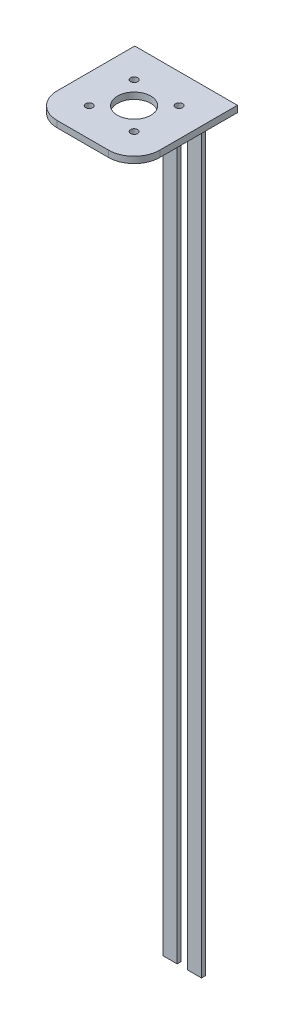
ISO-10303-21;
HEADER;
FILE_DESCRIPTION(('STEP AP214'),'2;1');
FILE_NAME('part.step','',(''),(''),'','','');
FILE_SCHEMA(('AUTOMOTIVE_DESIGN { 1 0 10303 214 1 1 1 1 }'));
ENDSEC;
DATA;
#1=APPLICATION_CONTEXT('core data for automotive mechanical design processes');
#2=APPLICATION_PROTOCOL_DEFINITION('international standard','automotive_design',2000,#1);
#3=PRODUCT_CONTEXT('',#1,'mechanical');
#4=PRODUCT('Part','Part','',(#3));
#5=PRODUCT_RELATED_PRODUCT_CATEGORY('part','',(#4));
#6=PRODUCT_DEFINITION_FORMATION('','',#4);
#7=PRODUCT_DEFINITION_CONTEXT('part definition',#1,'design');
#8=PRODUCT_DEFINITION('design','',#6,#7);
#9=PRODUCT_DEFINITION_SHAPE('','',#8);
#10=(LENGTH_UNIT() NAMED_UNIT(*) SI_UNIT(.MILLI.,.METRE.));
#11=(NAMED_UNIT(*) PLANE_ANGLE_UNIT() SI_UNIT($,.RADIAN.));
#12=(NAMED_UNIT(*) SI_UNIT($,.STERADIAN.) SOLID_ANGLE_UNIT());
#13=UNCERTAINTY_MEASURE_WITH_UNIT(LENGTH_MEASURE(1.E-05),#10,'distance_accuracy_value','');
#14=(GEOMETRIC_REPRESENTATION_CONTEXT(3) GLOBAL_UNCERTAINTY_ASSIGNED_CONTEXT((#13)) GLOBAL_UNIT_ASSIGNED_CONTEXT((#10,
#11,#12)) REPRESENTATION_CONTEXT('',''));
#15=CARTESIAN_POINT('',(0.,0.,0.));
#16=DIRECTION('',(0.,0.,1.));
#17=DIRECTION('',(1.,0.,0.));
#18=AXIS2_PLACEMENT_3D('',#15,#16,#17);
#19=CARTESIAN_POINT('',(0.,5.,0.));
#20=DIRECTION('',(0.,-1.,0.));
#21=DIRECTION('',(0.,0.,-1.));
#22=AXIS2_PLACEMENT_3D('',#19,#20,#21);
#23=PLANE('',#22);
#24=CARTESIAN_POINT('',(17.5,5.,-17.5));
#25=DIRECTION('',(0.,1.,0.));
#26=DIRECTION('',(0.,0.,1.));
#27=AXIS2_PLACEMENT_3D('',#24,#25,#26);
#28=CIRCLE('',#27,2.75);
#29=CARTESIAN_POINT('',(17.5,5.,-14.75));
#30=VERTEX_POINT('',#29);
#31=EDGE_CURVE('E320',#30,#30,#28,.T.);
#32=ORIENTED_EDGE('',*,*,#31,.F.);
#33=EDGE_LOOP('',(#32));
#34=FACE_BOUND('',#33,.T.);
#35=CARTESIAN_POINT('',(-17.5,5.,17.5));
#36=DIRECTION('',(0.,1.,0.));
#37=DIRECTION('',(0.,0.,1.));
#38=AXIS2_PLACEMENT_3D('',#35,#36,#37);
#39=CIRCLE('',#38,2.75);
#40=CARTESIAN_POINT('',(-17.5,5.,20.25));
#41=VERTEX_POINT('',#40);
#42=EDGE_CURVE('E308',#41,#41,#39,.T.);
#43=ORIENTED_EDGE('',*,*,#42,.F.);
#44=EDGE_LOOP('',(#43));
#45=FACE_BOUND('',#44,.T.);
#46=DIRECTION('',(1.,0.,0.));
#47=VECTOR('',#46,1.);
#48=CARTESIAN_POINT('',(40.,5.,40.));
#49=LINE('',#48,#47);
#50=CARTESIAN_POINT('',(-20.,5.,40.));
#51=VERTEX_POINT('',#50);
#52=CARTESIAN_POINT('',(20.,5.,40.));
#53=VERTEX_POINT('',#52);
#54=EDGE_CURVE('E251',#51,#53,#49,.T.);
#55=ORIENTED_EDGE('',*,*,#54,.T.);
#56=CARTESIAN_POINT('',(20.,5.,20.));
#57=DIRECTION('',(0.,-1.,0.));
#58=DIRECTION('',(0.,0.,-1.));
#59=AXIS2_PLACEMENT_3D('',#56,#57,#58);
#60=CIRCLE('',#59,20.);
#61=CARTESIAN_POINT('',(40.,5.,20.));
#62=VERTEX_POINT('',#61);
#63=EDGE_CURVE('E45',#53,#62,#60,.F.);
#64=ORIENTED_EDGE('',*,*,#63,.T.);
#65=DIRECTION('',(0.,0.,-1.));
#66=VECTOR('',#65,1.);
#67=CARTESIAN_POINT('',(40.,5.,40.));
#68=LINE('',#67,#66);
#69=CARTESIAN_POINT('',(40.,5.,-40.5));
#70=VERTEX_POINT('',#69);
#71=EDGE_CURVE('E248',#62,#70,#68,.T.);
#72=ORIENTED_EDGE('',*,*,#71,.T.);
#73=DIRECTION('',(-1.,0.,0.));
#74=VECTOR('',#73,1.);
#75=CARTESIAN_POINT('',(-40.,5.,-40.5));
#76=LINE('',#75,#74);
#77=CARTESIAN_POINT('',(-40.,5.,-40.5));
#78=VERTEX_POINT('',#77);
#79=EDGE_CURVE('E246',#70,#78,#76,.T.);
#80=ORIENTED_EDGE('',*,*,#79,.T.);
#81=DIRECTION('',(0.,0.,1.));
#82=VECTOR('',#81,1.);
#83=CARTESIAN_POINT('',(-40.,5.,-40.));
#84=LINE('',#83,#82);
#85=CARTESIAN_POINT('',(-40.,5.,20.));
#86=VERTEX_POINT('',#85);
#87=EDGE_CURVE('E236',#78,#86,#84,.T.);
#88=ORIENTED_EDGE('',*,*,#87,.T.);
#89=CARTESIAN_POINT('',(-20.,5.,20.));
#90=DIRECTION('',(0.,-1.,0.));
#91=DIRECTION('',(0.,0.,-1.));
#92=AXIS2_PLACEMENT_3D('',#89,#90,#91);
#93=CIRCLE('',#92,20.);
#94=EDGE_CURVE('E295',#86,#51,#93,.F.);
#95=ORIENTED_EDGE('',*,*,#94,.T.);
#96=EDGE_LOOP('',(#55,#64,#72,#80,#88,#95));
#97=FACE_BOUND('',#96,.T.);
#98=CARTESIAN_POINT('',(0.,5.,0.));
#99=DIRECTION('',(0.,1.,0.));
#100=DIRECTION('',(0.,0.,1.));
#101=AXIS2_PLACEMENT_3D('',#98,#99,#100);
#102=CIRCLE('',#101,13.);
#103=CARTESIAN_POINT('',(0.,5.,13.));
#104=VERTEX_POINT('',#103);
#105=EDGE_CURVE('E257',#104,#104,#102,.T.);
#106=ORIENTED_EDGE('',*,*,#105,.F.);
#107=EDGE_LOOP('',(#106));
#108=FACE_BOUND('',#107,.T.);
#109=CARTESIAN_POINT('',(17.5,5.,17.5));
#110=DIRECTION('',(0.,1.,0.));
#111=DIRECTION('',(0.,0.,1.));
#112=AXIS2_PLACEMENT_3D('',#109,#110,#111);
#113=CIRCLE('',#112,2.75);
#114=CARTESIAN_POINT('',(17.5,5.,20.25));
#115=VERTEX_POINT('',#114);
#116=EDGE_CURVE('E314',#115,#115,#113,.T.);
#117=ORIENTED_EDGE('',*,*,#116,.F.);
#118=EDGE_LOOP('',(#117));
#119=FACE_BOUND('',#118,.T.);
#120=CARTESIAN_POINT('',(-17.5,5.,-17.5));
#121=DIRECTION('',(0.,1.,0.));
#122=DIRECTION('',(0.,0.,1.));
#123=AXIS2_PLACEMENT_3D('',#120,#121,#122);
#124=CIRCLE('',#123,2.75);
#125=CARTESIAN_POINT('',(-17.5,5.,-14.75));
#126=VERTEX_POINT('',#125);
#127=EDGE_CURVE('E326',#126,#126,#124,.T.);
#128=ORIENTED_EDGE('',*,*,#127,.F.);
#129=EDGE_LOOP('',(#128));
#130=FACE_BOUND('',#129,.T.);
#131=ADVANCED_FACE('F37',(#34,#45,#97,#108,#119,#130),#23,.F.);
#132=CARTESIAN_POINT('',(0.,0.,0.));
#133=DIRECTION('',(0.,-1.,0.));
#134=DIRECTION('',(0.,0.,-1.));
#135=AXIS2_PLACEMENT_3D('',#132,#133,#134);
#136=PLANE('',#135);
#137=DIRECTION('',(0.,0.,-1.));
#138=VECTOR('',#137,1.);
#139=CARTESIAN_POINT('',(40.,0.,-40.5));
#140=LINE('',#139,#138);
#141=CARTESIAN_POINT('',(40.,0.,20.));
#142=VERTEX_POINT('',#141);
#143=CARTESIAN_POINT('',(40.,0.,-40.5));
#144=VERTEX_POINT('',#143);
#145=EDGE_CURVE('E221',#142,#144,#140,.T.);
#146=ORIENTED_EDGE('',*,*,#145,.F.);
#147=CARTESIAN_POINT('',(20.,0.,20.));
#148=DIRECTION('',(0.,-1.,0.));
#149=DIRECTION('',(0.,0.,-1.));
#150=AXIS2_PLACEMENT_3D('',#147,#148,#149);
#151=CIRCLE('',#150,20.);
#152=CARTESIAN_POINT('',(20.,0.,40.));
#153=VERTEX_POINT('',#152);
#154=EDGE_CURVE('E268',#142,#153,#151,.T.);
#155=ORIENTED_EDGE('',*,*,#154,.T.);
#156=DIRECTION('',(1.,0.,0.));
#157=VECTOR('',#156,1.);
#158=CARTESIAN_POINT('',(40.,0.,40.));
#159=LINE('',#158,#157);
#160=CARTESIAN_POINT('',(-20.,0.,40.));
#161=VERTEX_POINT('',#160);
#162=EDGE_CURVE('E256',#161,#153,#159,.T.);
#163=ORIENTED_EDGE('',*,*,#162,.F.);
#164=CARTESIAN_POINT('',(-20.,0.,20.));
#165=DIRECTION('',(0.,-1.,0.));
#166=DIRECTION('',(0.,0.,-1.));
#167=AXIS2_PLACEMENT_3D('',#164,#165,#166);
#168=CIRCLE('',#167,20.);
#169=CARTESIAN_POINT('',(-40.,0.,20.));
#170=VERTEX_POINT('',#169);
#171=EDGE_CURVE('E244',#161,#170,#168,.T.);
#172=ORIENTED_EDGE('',*,*,#171,.T.);
#173=DIRECTION('',(0.,0.,1.));
#174=VECTOR('',#173,1.);
#175=CARTESIAN_POINT('',(-40.,0.,40.));
#176=LINE('',#175,#174);
#177=CARTESIAN_POINT('',(-40.,0.,-40.5));
#178=VERTEX_POINT('',#177);
#179=EDGE_CURVE('E255',#178,#170,#176,.T.);
#180=ORIENTED_EDGE('',*,*,#179,.F.);
#181=DIRECTION('',(-1.,0.,0.));
#182=VECTOR('',#181,1.);
#183=CARTESIAN_POINT('',(-40.,0.,-40.5));
#184=LINE('',#183,#182);
#185=CARTESIAN_POINT('',(-15.,0.,-40.5));
#186=VERTEX_POINT('',#185);
#187=EDGE_CURVE('E217',#186,#178,#184,.T.);
#188=ORIENTED_EDGE('',*,*,#187,.F.);
#189=DIRECTION('',(0.,0.,-1.));
#190=VECTOR('',#189,1.);
#191=CARTESIAN_POINT('',(-15.,0.,-37.5));
#192=LINE('',#191,#190);
#193=CARTESIAN_POINT('',(-15.,0.,-37.5));
#194=VERTEX_POINT('',#193);
#195=EDGE_CURVE('E176',#194,#186,#192,.T.);
#196=ORIENTED_EDGE('',*,*,#195,.F.);
#197=DIRECTION('',(-1.,0.,0.));
#198=VECTOR('',#197,1.);
#199=CARTESIAN_POINT('',(0.,0.,-37.5));
#200=LINE('',#199,#198);
#201=CARTESIAN_POINT('',(-4.00000000000002,0.,-37.5));
#202=VERTEX_POINT('',#201);
#203=EDGE_CURVE('E150',#202,#194,#200,.T.);
#204=ORIENTED_EDGE('',*,*,#203,.F.);
#205=DIRECTION('',(0.,0.,-1.));
#206=VECTOR('',#205,1.);
#207=CARTESIAN_POINT('',(-4.00000000000002,0.,-37.5));
#208=LINE('',#207,#206);
#209=CARTESIAN_POINT('',(-4.00000000000002,0.,-40.5));
#210=VERTEX_POINT('',#209);
#211=EDGE_CURVE('E163',#202,#210,#208,.T.);
#212=ORIENTED_EDGE('',*,*,#211,.T.);
#213=CARTESIAN_POINT('',(4.00000000000002,0.,-40.5));
#214=VERTEX_POINT('',#213);
#215=EDGE_CURVE('E220',#214,#210,#184,.T.);
#216=ORIENTED_EDGE('',*,*,#215,.F.);
#217=DIRECTION('',(0.,0.,-1.));
#218=VECTOR('',#217,1.);
#219=CARTESIAN_POINT('',(4.00000000000002,0.,-37.5));
#220=LINE('',#219,#218);
#221=CARTESIAN_POINT('',(4.00000000000002,0.,-37.5));
#222=VERTEX_POINT('',#221);
#223=EDGE_CURVE('E207',#222,#214,#220,.T.);
#224=ORIENTED_EDGE('',*,*,#223,.F.);
#225=DIRECTION('',(-1.,0.,0.));
#226=VECTOR('',#225,1.);
#227=CARTESIAN_POINT('',(0.,0.,-37.5));
#228=LINE('',#227,#226);
#229=CARTESIAN_POINT('',(15.,0.,-37.5));
#230=VERTEX_POINT('',#229);
#231=EDGE_CURVE('E187',#230,#222,#228,.T.);
#232=ORIENTED_EDGE('',*,*,#231,.F.);
#233=DIRECTION('',(0.,0.,-1.));
#234=VECTOR('',#233,1.);
#235=CARTESIAN_POINT('',(15.,0.,-37.5));
#236=LINE('',#235,#234);
#237=CARTESIAN_POINT('',(15.,0.,-40.5));
#238=VERTEX_POINT('',#237);
#239=EDGE_CURVE('E199',#230,#238,#236,.T.);
#240=ORIENTED_EDGE('',*,*,#239,.T.);
#241=EDGE_CURVE('E234',#144,#238,#184,.T.);
#242=ORIENTED_EDGE('',*,*,#241,.F.);
#243=EDGE_LOOP('',(#146,#155,#163,#172,#180,#188,#196,#204,#212,#216,#224,#232,#240,#242));
#244=FACE_BOUND('',#243,.T.);
#245=CARTESIAN_POINT('',(17.5,0.,-17.5));
#246=DIRECTION('',(0.,1.,0.));
#247=DIRECTION('',(0.,0.,1.));
#248=AXIS2_PLACEMENT_3D('',#245,#246,#247);
#249=CIRCLE('',#248,2.75);
#250=CARTESIAN_POINT('',(17.5,0.,-14.75));
#251=VERTEX_POINT('',#250);
#252=EDGE_CURVE('E323',#251,#251,#249,.T.);
#253=ORIENTED_EDGE('',*,*,#252,.T.);
#254=EDGE_LOOP('',(#253));
#255=FACE_BOUND('',#254,.T.);
#256=CARTESIAN_POINT('',(-17.5,0.,17.5));
#257=DIRECTION('',(0.,1.,0.));
#258=DIRECTION('',(0.,0.,1.));
#259=AXIS2_PLACEMENT_3D('',#256,#257,#258);
#260=CIRCLE('',#259,2.75);
#261=CARTESIAN_POINT('',(-17.5,0.,20.25));
#262=VERTEX_POINT('',#261);
#263=EDGE_CURVE('E311',#262,#262,#260,.T.);
#264=ORIENTED_EDGE('',*,*,#263,.T.);
#265=EDGE_LOOP('',(#264));
#266=FACE_BOUND('',#265,.T.);
#267=CARTESIAN_POINT('',(0.,0.,0.));
#268=DIRECTION('',(0.,1.,0.));
#269=DIRECTION('',(0.,0.,1.));
#270=AXIS2_PLACEMENT_3D('',#267,#268,#269);
#271=CIRCLE('',#270,13.);
#272=CARTESIAN_POINT('',(0.,0.,13.));
#273=VERTEX_POINT('',#272);
#274=EDGE_CURVE('E305',#273,#273,#271,.T.);
#275=ORIENTED_EDGE('',*,*,#274,.T.);
#276=EDGE_LOOP('',(#275));
#277=FACE_BOUND('',#276,.T.);
#278=CARTESIAN_POINT('',(17.5,0.,17.5));
#279=DIRECTION('',(0.,1.,0.));
#280=DIRECTION('',(0.,0.,1.));
#281=AXIS2_PLACEMENT_3D('',#278,#279,#280);
#282=CIRCLE('',#281,2.75);
#283=CARTESIAN_POINT('',(17.5,0.,20.25));
#284=VERTEX_POINT('',#283);
#285=EDGE_CURVE('E317',#284,#284,#282,.T.);
#286=ORIENTED_EDGE('',*,*,#285,.T.);
#287=EDGE_LOOP('',(#286));
#288=FACE_BOUND('',#287,.T.);
#289=CARTESIAN_POINT('',(-17.5,0.,-17.5));
#290=DIRECTION('',(0.,1.,0.));
#291=DIRECTION('',(0.,0.,1.));
#292=AXIS2_PLACEMENT_3D('',#289,#290,#291);
#293=CIRCLE('',#292,2.75);
#294=CARTESIAN_POINT('',(-17.5,0.,-14.75));
#295=VERTEX_POINT('',#294);
#296=EDGE_CURVE('E198',#295,#295,#293,.T.);
#297=ORIENTED_EDGE('',*,*,#296,.T.);
#298=EDGE_LOOP('',(#297));
#299=FACE_BOUND('',#298,.T.);
#300=ADVANCED_FACE('F266',(#244,#255,#266,#277,#288,#299),#136,.T.);
#301=CARTESIAN_POINT('',(-40.,5.,40.));
#302=DIRECTION('',(1.,0.,0.));
#303=DIRECTION('',(0.,0.,-1.));
#304=AXIS2_PLACEMENT_3D('',#301,#302,#303);
#305=PLANE('',#304);
#306=ORIENTED_EDGE('',*,*,#179,.T.);
#307=DIRECTION('',(0.,-1.,0.));
#308=VECTOR('',#307,1.);
#309=CARTESIAN_POINT('',(-40.,5.,20.));
#310=LINE('',#309,#308);
#311=EDGE_CURVE('E11',#170,#86,#310,.F.);
#312=ORIENTED_EDGE('',*,*,#311,.T.);
#313=ORIENTED_EDGE('',*,*,#87,.F.);
#314=DIRECTION('',(0.,-1.,0.));
#315=VECTOR('',#314,1.);
#316=CARTESIAN_POINT('',(-40.,5.,-40.5));
#317=LINE('',#316,#315);
#318=EDGE_CURVE('E228',#78,#178,#317,.T.);
#319=ORIENTED_EDGE('',*,*,#318,.T.);
#320=EDGE_LOOP('',(#306,#312,#313,#319));
#321=FACE_BOUND('',#320,.T.);
#322=ADVANCED_FACE('F291',(#321),#305,.F.);
#323=CARTESIAN_POINT('',(40.,5.,40.));
#324=DIRECTION('',(0.,0.,-1.));
#325=DIRECTION('',(-1.,0.,0.));
#326=AXIS2_PLACEMENT_3D('',#323,#324,#325);
#327=PLANE('',#326);
#328=ORIENTED_EDGE('',*,*,#162,.T.);
#329=DIRECTION('',(0.,-1.,0.));
#330=VECTOR('',#329,1.);
#331=CARTESIAN_POINT('',(20.,5.,40.));
#332=LINE('',#331,#330);
#333=EDGE_CURVE('E58',#153,#53,#332,.F.);
#334=ORIENTED_EDGE('',*,*,#333,.T.);
#335=ORIENTED_EDGE('',*,*,#54,.F.);
#336=DIRECTION('',(0.,-1.,0.));
#337=VECTOR('',#336,1.);
#338=CARTESIAN_POINT('',(-20.,5.,40.));
#339=LINE('',#338,#337);
#340=EDGE_CURVE('E296',#51,#161,#339,.T.);
#341=ORIENTED_EDGE('',*,*,#340,.T.);
#342=EDGE_LOOP('',(#328,#334,#335,#341));
#343=FACE_BOUND('',#342,.T.);
#344=ADVANCED_FACE('F301',(#343),#327,.F.);
#345=CARTESIAN_POINT('',(40.,5.,-40.5));
#346=DIRECTION('',(-1.,0.,0.));
#347=DIRECTION('',(0.,0.,1.));
#348=AXIS2_PLACEMENT_3D('',#345,#346,#347);
#349=PLANE('',#348);
#350=ORIENTED_EDGE('',*,*,#71,.F.);
#351=DIRECTION('',(0.,-1.,0.));
#352=VECTOR('',#351,1.);
#353=CARTESIAN_POINT('',(40.,5.,20.));
#354=LINE('',#353,#352);
#355=EDGE_CURVE('E222',#62,#142,#354,.T.);
#356=ORIENTED_EDGE('',*,*,#355,.T.);
#357=ORIENTED_EDGE('',*,*,#145,.T.);
#358=DIRECTION('',(0.,-1.,0.));
#359=VECTOR('',#358,1.);
#360=CARTESIAN_POINT('',(40.,5.,-40.5));
#361=LINE('',#360,#359);
#362=EDGE_CURVE('E237',#70,#144,#361,.T.);
#363=ORIENTED_EDGE('',*,*,#362,.F.);
#364=EDGE_LOOP('',(#350,#356,#357,#363));
#365=FACE_BOUND('',#364,.T.);
#366=ADVANCED_FACE('F263',(#365),#349,.F.);
#367=CARTESIAN_POINT('',(-40.,5.,-40.5));
#368=DIRECTION('',(0.,0.,1.));
#369=DIRECTION('',(1.,0.,0.));
#370=AXIS2_PLACEMENT_3D('',#367,#368,#369);
#371=PLANE('',#370);
#372=ORIENTED_EDGE('',*,*,#241,.T.);
#373=DIRECTION('',(0.,-1.,0.));
#374=VECTOR('',#373,1.);
#375=CARTESIAN_POINT('',(15.,0.,-40.5));
#376=LINE('',#375,#374);
#377=CARTESIAN_POINT('',(14.9999999999999,-595.,-40.5));
#378=VERTEX_POINT('',#377);
#379=EDGE_CURVE('E184',#238,#378,#376,.T.);
#380=ORIENTED_EDGE('',*,*,#379,.T.);
#381=DIRECTION('',(-1.,0.,0.));
#382=VECTOR('',#381,1.);
#383=CARTESIAN_POINT('',(0.,-595.,-40.5));
#384=LINE('',#383,#382);
#385=CARTESIAN_POINT('',(4.00000000000004,-595.,-40.5));
#386=VERTEX_POINT('',#385);
#387=EDGE_CURVE('E175',#378,#386,#384,.T.);
#388=ORIENTED_EDGE('',*,*,#387,.T.);
#389=DIRECTION('',(0.,1.,0.));
#390=VECTOR('',#389,1.);
#391=CARTESIAN_POINT('',(4.,0.,-40.5));
#392=LINE('',#391,#390);
#393=EDGE_CURVE('E195',#386,#214,#392,.T.);
#394=ORIENTED_EDGE('',*,*,#393,.T.);
#395=ORIENTED_EDGE('',*,*,#215,.T.);
#396=DIRECTION('',(0.,-1.,0.));
#397=VECTOR('',#396,1.);
#398=CARTESIAN_POINT('',(-4.,0.,-40.5));
#399=LINE('',#398,#397);
#400=CARTESIAN_POINT('',(-4.00000000000003,-595.,-40.5));
#401=VERTEX_POINT('',#400);
#402=EDGE_CURVE('E171',#210,#401,#399,.T.);
#403=ORIENTED_EDGE('',*,*,#402,.T.);
#404=DIRECTION('',(-1.,0.,0.));
#405=VECTOR('',#404,1.);
#406=CARTESIAN_POINT('',(0.,-595.,-40.5));
#407=LINE('',#406,#405);
#408=CARTESIAN_POINT('',(-15.0000000000001,-595.,-40.5));
#409=VERTEX_POINT('',#408);
#410=EDGE_CURVE('E145',#401,#409,#407,.T.);
#411=ORIENTED_EDGE('',*,*,#410,.T.);
#412=DIRECTION('',(0.,-1.,0.));
#413=VECTOR('',#412,1.);
#414=CARTESIAN_POINT('',(-15.,0.,-40.5));
#415=LINE('',#414,#413);
#416=EDGE_CURVE('E164',#186,#409,#415,.T.);
#417=ORIENTED_EDGE('',*,*,#416,.F.);
#418=ORIENTED_EDGE('',*,*,#187,.T.);
#419=ORIENTED_EDGE('',*,*,#318,.F.);
#420=ORIENTED_EDGE('',*,*,#79,.F.);
#421=ORIENTED_EDGE('',*,*,#362,.T.);
#422=EDGE_LOOP('',(#372,#380,#388,#394,#395,#403,#411,#417,#418,#419,#420,#421));
#423=FACE_BOUND('',#422,.T.);
#424=ADVANCED_FACE('F271',(#423),#371,.F.);
#425=CARTESIAN_POINT('',(0.,5.,0.));
#426=DIRECTION('',(0.,-1.,0.));
#427=DIRECTION('',(0.,0.,-1.));
#428=AXIS2_PLACEMENT_3D('',#425,#426,#427);
#429=CYLINDRICAL_SURFACE('',#428,13.);
#430=ORIENTED_EDGE('',*,*,#105,.T.);
#431=EDGE_LOOP('',(#430));
#432=FACE_BOUND('',#431,.T.);
#433=ORIENTED_EDGE('',*,*,#274,.F.);
#434=EDGE_LOOP('',(#433));
#435=FACE_BOUND('',#434,.T.);
#436=ADVANCED_FACE('F346',(#432,#435),#429,.F.);
#437=CARTESIAN_POINT('',(-17.5,5.,17.5));
#438=DIRECTION('',(0.,-1.,0.));
#439=DIRECTION('',(0.,0.,-1.));
#440=AXIS2_PLACEMENT_3D('',#437,#438,#439);
#441=CYLINDRICAL_SURFACE('',#440,2.75);
#442=ORIENTED_EDGE('',*,*,#42,.T.);
#443=EDGE_LOOP('',(#442));
#444=FACE_BOUND('',#443,.T.);
#445=ORIENTED_EDGE('',*,*,#263,.F.);
#446=EDGE_LOOP('',(#445));
#447=FACE_BOUND('',#446,.T.);
#448=ADVANCED_FACE('F373',(#444,#447),#441,.F.);
#449=CARTESIAN_POINT('',(17.5,5.,17.5));
#450=DIRECTION('',(0.,-1.,0.));
#451=DIRECTION('',(0.,0.,-1.));
#452=AXIS2_PLACEMENT_3D('',#449,#450,#451);
#453=CYLINDRICAL_SURFACE('',#452,2.75);
#454=ORIENTED_EDGE('',*,*,#116,.T.);
#455=EDGE_LOOP('',(#454));
#456=FACE_BOUND('',#455,.T.);
#457=ORIENTED_EDGE('',*,*,#285,.F.);
#458=EDGE_LOOP('',(#457));
#459=FACE_BOUND('',#458,.T.);
#460=ADVANCED_FACE('F369',(#456,#459),#453,.F.);
#461=CARTESIAN_POINT('',(17.5,5.,-17.5));
#462=DIRECTION('',(0.,-1.,0.));
#463=DIRECTION('',(0.,0.,-1.));
#464=AXIS2_PLACEMENT_3D('',#461,#462,#463);
#465=CYLINDRICAL_SURFACE('',#464,2.75);
#466=ORIENTED_EDGE('',*,*,#31,.T.);
#467=EDGE_LOOP('',(#466));
#468=FACE_BOUND('',#467,.T.);
#469=ORIENTED_EDGE('',*,*,#252,.F.);
#470=EDGE_LOOP('',(#469));
#471=FACE_BOUND('',#470,.T.);
#472=ADVANCED_FACE('F372',(#468,#471),#465,.F.);
#473=CARTESIAN_POINT('',(-17.5,5.,-17.5));
#474=DIRECTION('',(0.,-1.,0.));
#475=DIRECTION('',(0.,0.,-1.));
#476=AXIS2_PLACEMENT_3D('',#473,#474,#475);
#477=CYLINDRICAL_SURFACE('',#476,2.75);
#478=ORIENTED_EDGE('',*,*,#127,.T.);
#479=EDGE_LOOP('',(#478));
#480=FACE_BOUND('',#479,.T.);
#481=ORIENTED_EDGE('',*,*,#296,.F.);
#482=EDGE_LOOP('',(#481));
#483=FACE_BOUND('',#482,.T.);
#484=ADVANCED_FACE('F333',(#480,#483),#477,.F.);
#485=CARTESIAN_POINT('',(0.,-595.,-37.5));
#486=DIRECTION('',(0.,-1.,0.));
#487=DIRECTION('',(0.,0.,-1.));
#488=AXIS2_PLACEMENT_3D('',#485,#486,#487);
#489=PLANE('',#488);
#490=ORIENTED_EDGE('',*,*,#387,.F.);
#491=DIRECTION('',(0.,0.,-1.));
#492=VECTOR('',#491,1.);
#493=CARTESIAN_POINT('',(14.9999999999999,-595.,-37.5));
#494=LINE('',#493,#492);
#495=CARTESIAN_POINT('',(14.9999999999999,-595.,-37.5));
#496=VERTEX_POINT('',#495);
#497=EDGE_CURVE('E196',#496,#378,#494,.T.);
#498=ORIENTED_EDGE('',*,*,#497,.F.);
#499=DIRECTION('',(-1.,0.,0.));
#500=VECTOR('',#499,1.);
#501=CARTESIAN_POINT('',(0.,-595.,-37.5));
#502=LINE('',#501,#500);
#503=CARTESIAN_POINT('',(4.00000000000004,-595.,-37.5));
#504=VERTEX_POINT('',#503);
#505=EDGE_CURVE('E180',#496,#504,#502,.T.);
#506=ORIENTED_EDGE('',*,*,#505,.T.);
#507=DIRECTION('',(0.,0.,-1.));
#508=VECTOR('',#507,1.);
#509=CARTESIAN_POINT('',(4.00000000000004,-595.,-37.5));
#510=LINE('',#509,#508);
#511=EDGE_CURVE('E192',#504,#386,#510,.T.);
#512=ORIENTED_EDGE('',*,*,#511,.T.);
#513=EDGE_LOOP('',(#490,#498,#506,#512));
#514=FACE_BOUND('',#513,.T.);
#515=ADVANCED_FACE('F278',(#514),#489,.T.);
#516=CARTESIAN_POINT('',(15.,0.,-37.5));
#517=DIRECTION('',(1.,0.,0.));
#518=DIRECTION('',(0.,1.,0.));
#519=AXIS2_PLACEMENT_3D('',#516,#517,#518);
#520=PLANE('',#519);
#521=ORIENTED_EDGE('',*,*,#379,.F.);
#522=ORIENTED_EDGE('',*,*,#239,.F.);
#523=DIRECTION('',(0.,-1.,0.));
#524=VECTOR('',#523,1.);
#525=CARTESIAN_POINT('',(15.,0.,-37.5));
#526=LINE('',#525,#524);
#527=EDGE_CURVE('E189',#230,#496,#526,.T.);
#528=ORIENTED_EDGE('',*,*,#527,.T.);
#529=ORIENTED_EDGE('',*,*,#497,.T.);
#530=EDGE_LOOP('',(#521,#522,#528,#529));
#531=FACE_BOUND('',#530,.T.);
#532=ADVANCED_FACE('F274',(#531),#520,.T.);
#533=CARTESIAN_POINT('',(4.,0.,-37.5));
#534=DIRECTION('',(-1.,0.,0.));
#535=DIRECTION('',(0.,-1.,0.));
#536=AXIS2_PLACEMENT_3D('',#533,#534,#535);
#537=PLANE('',#536);
#538=ORIENTED_EDGE('',*,*,#393,.F.);
#539=ORIENTED_EDGE('',*,*,#511,.F.);
#540=DIRECTION('',(0.,1.,0.));
#541=VECTOR('',#540,1.);
#542=CARTESIAN_POINT('',(4.,0.,-37.5));
#543=LINE('',#542,#541);
#544=EDGE_CURVE('E183',#504,#222,#543,.T.);
#545=ORIENTED_EDGE('',*,*,#544,.T.);
#546=ORIENTED_EDGE('',*,*,#223,.T.);
#547=EDGE_LOOP('',(#538,#539,#545,#546));
#548=FACE_BOUND('',#547,.T.);
#549=ADVANCED_FACE('F282',(#548),#537,.T.);
#550=CARTESIAN_POINT('',(0.,0.,-37.5));
#551=DIRECTION('',(0.,0.,-1.));
#552=DIRECTION('',(-1.,0.,0.));
#553=AXIS2_PLACEMENT_3D('',#550,#551,#552);
#554=PLANE('',#553);
#555=ORIENTED_EDGE('',*,*,#505,.F.);
#556=ORIENTED_EDGE('',*,*,#527,.F.);
#557=ORIENTED_EDGE('',*,*,#231,.T.);
#558=ORIENTED_EDGE('',*,*,#544,.F.);
#559=EDGE_LOOP('',(#555,#556,#557,#558));
#560=FACE_BOUND('',#559,.T.);
#561=ADVANCED_FACE('F462',(#560),#554,.F.);
#562=CARTESIAN_POINT('',(-4.,0.,-37.5));
#563=DIRECTION('',(1.,0.,0.));
#564=DIRECTION('',(0.,1.,0.));
#565=AXIS2_PLACEMENT_3D('',#562,#563,#564);
#566=PLANE('',#565);
#567=ORIENTED_EDGE('',*,*,#402,.F.);
#568=ORIENTED_EDGE('',*,*,#211,.F.);
#569=DIRECTION('',(0.,-1.,0.));
#570=VECTOR('',#569,1.);
#571=CARTESIAN_POINT('',(-4.,0.,-37.5));
#572=LINE('',#571,#570);
#573=CARTESIAN_POINT('',(-4.00000000000003,-595.,-37.5));
#574=VERTEX_POINT('',#573);
#575=EDGE_CURVE('E155',#202,#574,#572,.T.);
#576=ORIENTED_EDGE('',*,*,#575,.T.);
#577=DIRECTION('',(0.,0.,-1.));
#578=VECTOR('',#577,1.);
#579=CARTESIAN_POINT('',(-4.00000000000003,-595.,-37.5));
#580=LINE('',#579,#578);
#581=EDGE_CURVE('E140',#574,#401,#580,.T.);
#582=ORIENTED_EDGE('',*,*,#581,.T.);
#583=EDGE_LOOP('',(#567,#568,#576,#582));
#584=FACE_BOUND('',#583,.T.);
#585=ADVANCED_FACE('F161',(#584),#566,.T.);
#586=CARTESIAN_POINT('',(-15.,0.,-37.5));
#587=DIRECTION('',(1.,0.,0.));
#588=DIRECTION('',(0.,1.,0.));
#589=AXIS2_PLACEMENT_3D('',#586,#587,#588);
#590=PLANE('',#589);
#591=ORIENTED_EDGE('',*,*,#416,.T.);
#592=DIRECTION('',(0.,0.,-1.));
#593=VECTOR('',#592,1.);
#594=CARTESIAN_POINT('',(-15.0000000000001,-595.,-37.5));
#595=LINE('',#594,#593);
#596=CARTESIAN_POINT('',(-15.0000000000001,-595.,-37.5));
#597=VERTEX_POINT('',#596);
#598=EDGE_CURVE('E149',#597,#409,#595,.T.);
#599=ORIENTED_EDGE('',*,*,#598,.F.);
#600=DIRECTION('',(0.,-1.,0.));
#601=VECTOR('',#600,1.);
#602=CARTESIAN_POINT('',(-15.,0.,-37.5));
#603=LINE('',#602,#601);
#604=EDGE_CURVE('E158',#194,#597,#603,.T.);
#605=ORIENTED_EDGE('',*,*,#604,.F.);
#606=ORIENTED_EDGE('',*,*,#195,.T.);
#607=EDGE_LOOP('',(#591,#599,#605,#606));
#608=FACE_BOUND('',#607,.T.);
#609=ADVANCED_FACE('F289',(#608),#590,.F.);
#610=CARTESIAN_POINT('',(0.,-595.,-37.5));
#611=DIRECTION('',(0.,-1.,0.));
#612=DIRECTION('',(0.,0.,-1.));
#613=AXIS2_PLACEMENT_3D('',#610,#611,#612);
#614=PLANE('',#613);
#615=ORIENTED_EDGE('',*,*,#410,.F.);
#616=ORIENTED_EDGE('',*,*,#581,.F.);
#617=DIRECTION('',(-1.,0.,0.));
#618=VECTOR('',#617,1.);
#619=CARTESIAN_POINT('',(0.,-595.,-37.5));
#620=LINE('',#619,#618);
#621=EDGE_CURVE('E143',#574,#597,#620,.T.);
#622=ORIENTED_EDGE('',*,*,#621,.T.);
#623=ORIENTED_EDGE('',*,*,#598,.T.);
#624=EDGE_LOOP('',(#615,#616,#622,#623));
#625=FACE_BOUND('',#624,.T.);
#626=ADVANCED_FACE('F142',(#625),#614,.T.);
#627=CARTESIAN_POINT('',(0.,0.,-37.5));
#628=DIRECTION('',(0.,0.,-1.));
#629=DIRECTION('',(-1.,0.,0.));
#630=AXIS2_PLACEMENT_3D('',#627,#628,#629);
#631=PLANE('',#630);
#632=ORIENTED_EDGE('',*,*,#575,.F.);
#633=ORIENTED_EDGE('',*,*,#203,.T.);
#634=ORIENTED_EDGE('',*,*,#604,.T.);
#635=ORIENTED_EDGE('',*,*,#621,.F.);
#636=EDGE_LOOP('',(#632,#633,#634,#635));
#637=FACE_BOUND('',#636,.T.);
#638=ADVANCED_FACE('F154',(#637),#631,.F.);
#639=CARTESIAN_POINT('',(20.,5.,20.));
#640=DIRECTION('',(0.,-1.,0.));
#641=DIRECTION('',(0.,0.,-1.));
#642=AXIS2_PLACEMENT_3D('',#639,#640,#641);
#643=CYLINDRICAL_SURFACE('',#642,20.);
#644=ORIENTED_EDGE('',*,*,#63,.F.);
#645=ORIENTED_EDGE('',*,*,#333,.F.);
#646=ORIENTED_EDGE('',*,*,#154,.F.);
#647=ORIENTED_EDGE('',*,*,#355,.F.);
#648=EDGE_LOOP('',(#644,#645,#646,#647));
#649=FACE_BOUND('',#648,.T.);
#650=ADVANCED_FACE('F356',(#649),#643,.T.);
#651=CARTESIAN_POINT('',(-20.,5.,20.));
#652=DIRECTION('',(0.,-1.,0.));
#653=DIRECTION('',(0.,0.,-1.));
#654=AXIS2_PLACEMENT_3D('',#651,#652,#653);
#655=CYLINDRICAL_SURFACE('',#654,20.);
#656=ORIENTED_EDGE('',*,*,#94,.F.);
#657=ORIENTED_EDGE('',*,*,#311,.F.);
#658=ORIENTED_EDGE('',*,*,#171,.F.);
#659=ORIENTED_EDGE('',*,*,#340,.F.);
#660=EDGE_LOOP('',(#656,#657,#658,#659));
#661=FACE_BOUND('',#660,.T.);
#662=ADVANCED_FACE('F39',(#661),#655,.T.);
#663=CLOSED_SHELL('',(#131,#300,#322,#344,#366,#424,#436,#448,#460,#472,#484,#515,#532,#549,
#561,#585,#609,#626,#638,#650,#662));
#664=MANIFOLD_SOLID_BREP('B2',#663);
#665=ADVANCED_BREP_SHAPE_REPRESENTATION('',(#18,#664),#14);
#666=SHAPE_DEFINITION_REPRESENTATION(#9,#665);
ENDSEC;
END-ISO-10303-21;
